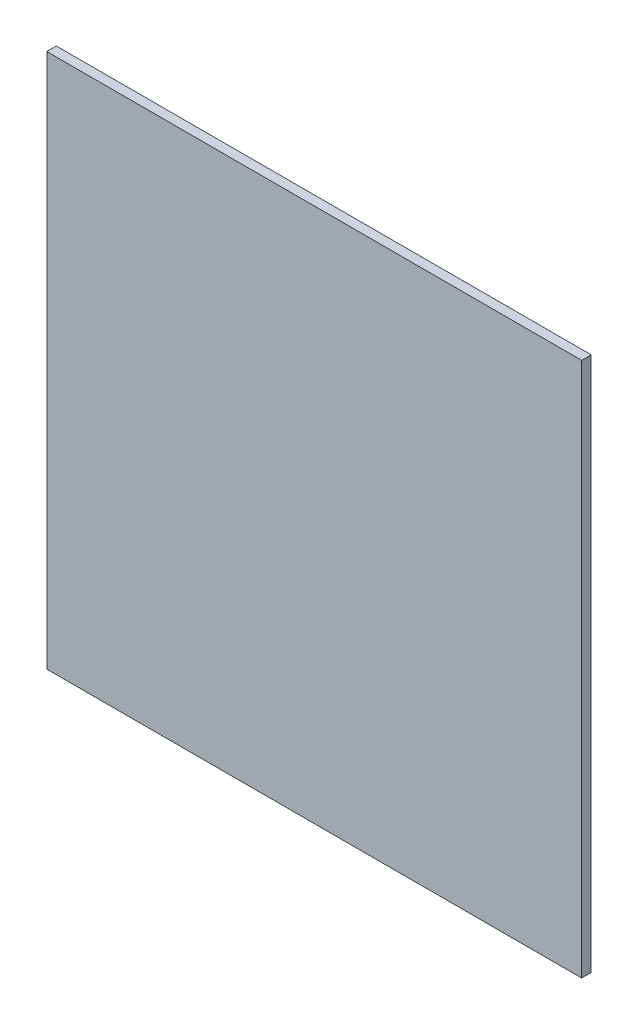
ISO-10303-21;
HEADER;
FILE_DESCRIPTION(('STEP AP214'),'2;1');
FILE_NAME('part.step','',(''),(''),'','','');
FILE_SCHEMA(('AUTOMOTIVE_DESIGN { 1 0 10303 214 1 1 1 1 }'));
ENDSEC;
DATA;
#1=APPLICATION_CONTEXT('core data for automotive mechanical design processes');
#2=APPLICATION_PROTOCOL_DEFINITION('international standard','automotive_design',2000,#1);
#3=PRODUCT_CONTEXT('',#1,'mechanical');
#4=PRODUCT('Part','Part','',(#3));
#5=PRODUCT_RELATED_PRODUCT_CATEGORY('part','',(#4));
#6=PRODUCT_DEFINITION_FORMATION('','',#4);
#7=PRODUCT_DEFINITION_CONTEXT('part definition',#1,'design');
#8=PRODUCT_DEFINITION('design','',#6,#7);
#9=PRODUCT_DEFINITION_SHAPE('','',#8);
#10=(LENGTH_UNIT() NAMED_UNIT(*) SI_UNIT(.MILLI.,.METRE.));
#11=(NAMED_UNIT(*) PLANE_ANGLE_UNIT() SI_UNIT($,.RADIAN.));
#12=(NAMED_UNIT(*) SI_UNIT($,.STERADIAN.) SOLID_ANGLE_UNIT());
#13=UNCERTAINTY_MEASURE_WITH_UNIT(LENGTH_MEASURE(1.E-05),#10,'distance_accuracy_value','');
#14=(GEOMETRIC_REPRESENTATION_CONTEXT(3) GLOBAL_UNCERTAINTY_ASSIGNED_CONTEXT((#13)) GLOBAL_UNIT_ASSIGNED_CONTEXT((#10,
#11,#12)) REPRESENTATION_CONTEXT('',''));
#15=CARTESIAN_POINT('',(0.,0.,0.));
#16=DIRECTION('',(0.,0.,1.));
#17=DIRECTION('',(1.,0.,0.));
#18=AXIS2_PLACEMENT_3D('',#15,#16,#17);
#19=CARTESIAN_POINT('',(0.,0.,0.));
#20=DIRECTION('',(1.,0.,0.));
#21=DIRECTION('',(0.,0.,1.));
#22=AXIS2_PLACEMENT_3D('',#19,#20,#21);
#23=PLANE('',#22);
#24=DIRECTION('',(0.,1.,0.));
#25=VECTOR('',#24,1.);
#26=CARTESIAN_POINT('',(0.,0.,0.1));
#27=LINE('',#26,#25);
#28=CARTESIAN_POINT('',(0.,0.,0.1));
#29=VERTEX_POINT('',#28);
#30=CARTESIAN_POINT('',(0.,5.6,0.1));
#31=VERTEX_POINT('',#30);
#32=EDGE_CURVE('E11',#29,#31,#27,.T.);
#33=ORIENTED_EDGE('',*,*,#32,.T.);
#34=DIRECTION('',(0.,0.,1.));
#35=VECTOR('',#34,1.);
#36=CARTESIAN_POINT('',(0.,5.6,0.));
#37=LINE('',#36,#35);
#38=CARTESIAN_POINT('',(0.,5.6,0.));
#39=VERTEX_POINT('',#38);
#40=EDGE_CURVE('E23',#39,#31,#37,.T.);
#41=ORIENTED_EDGE('',*,*,#40,.F.);
#42=DIRECTION('',(0.,1.,0.));
#43=VECTOR('',#42,1.);
#44=CARTESIAN_POINT('',(0.,0.,0.));
#45=LINE('',#44,#43);
#46=CARTESIAN_POINT('',(0.,0.,0.));
#47=VERTEX_POINT('',#46);
#48=EDGE_CURVE('E85',#47,#39,#45,.T.);
#49=ORIENTED_EDGE('',*,*,#48,.F.);
#50=DIRECTION('',(0.,0.,1.));
#51=VECTOR('',#50,1.);
#52=CARTESIAN_POINT('',(0.,0.,0.));
#53=LINE('',#52,#51);
#54=EDGE_CURVE('E35',#47,#29,#53,.T.);
#55=ORIENTED_EDGE('',*,*,#54,.T.);
#56=EDGE_LOOP('',(#33,#41,#49,#55));
#57=FACE_BOUND('',#56,.T.);
#58=ADVANCED_FACE('F16',(#57),#23,.F.);
#59=CARTESIAN_POINT('',(5.6,0.,0.));
#60=DIRECTION('',(1.,0.,0.));
#61=DIRECTION('',(0.,0.,1.));
#62=AXIS2_PLACEMENT_3D('',#59,#60,#61);
#63=PLANE('',#62);
#64=DIRECTION('',(0.,0.,1.));
#65=VECTOR('',#64,1.);
#66=CARTESIAN_POINT('',(5.6,0.,0.));
#67=LINE('',#66,#65);
#68=CARTESIAN_POINT('',(5.6,0.,0.));
#69=VERTEX_POINT('',#68);
#70=CARTESIAN_POINT('',(5.6,0.,0.1));
#71=VERTEX_POINT('',#70);
#72=EDGE_CURVE('E82',#69,#71,#67,.T.);
#73=ORIENTED_EDGE('',*,*,#72,.F.);
#74=DIRECTION('',(0.,1.,0.));
#75=VECTOR('',#74,1.);
#76=CARTESIAN_POINT('',(5.6,0.,0.));
#77=LINE('',#76,#75);
#78=CARTESIAN_POINT('',(5.6,5.6,0.));
#79=VERTEX_POINT('',#78);
#80=EDGE_CURVE('E62',#69,#79,#77,.T.);
#81=ORIENTED_EDGE('',*,*,#80,.T.);
#82=DIRECTION('',(0.,0.,1.));
#83=VECTOR('',#82,1.);
#84=CARTESIAN_POINT('',(5.6,5.6,0.));
#85=LINE('',#84,#83);
#86=CARTESIAN_POINT('',(5.6,5.6,0.1));
#87=VERTEX_POINT('',#86);
#88=EDGE_CURVE('E56',#79,#87,#85,.T.);
#89=ORIENTED_EDGE('',*,*,#88,.T.);
#90=DIRECTION('',(0.,1.,0.));
#91=VECTOR('',#90,1.);
#92=CARTESIAN_POINT('',(5.6,0.,0.1));
#93=LINE('',#92,#91);
#94=EDGE_CURVE('E59',#71,#87,#93,.T.);
#95=ORIENTED_EDGE('',*,*,#94,.F.);
#96=EDGE_LOOP('',(#73,#81,#89,#95));
#97=FACE_BOUND('',#96,.T.);
#98=ADVANCED_FACE('F58',(#97),#63,.T.);
#99=CARTESIAN_POINT('',(0.,0.,0.));
#100=DIRECTION('',(0.,1.,0.));
#101=DIRECTION('',(0.,0.,1.));
#102=AXIS2_PLACEMENT_3D('',#99,#100,#101);
#103=PLANE('',#102);
#104=ORIENTED_EDGE('',*,*,#72,.T.);
#105=DIRECTION('',(1.,0.,0.));
#106=VECTOR('',#105,1.);
#107=CARTESIAN_POINT('',(0.,0.,0.1));
#108=LINE('',#107,#106);
#109=EDGE_CURVE('E70',#29,#71,#108,.T.);
#110=ORIENTED_EDGE('',*,*,#109,.F.);
#111=ORIENTED_EDGE('',*,*,#54,.F.);
#112=DIRECTION('',(1.,0.,0.));
#113=VECTOR('',#112,1.);
#114=CARTESIAN_POINT('',(0.,0.,0.));
#115=LINE('',#114,#113);
#116=EDGE_CURVE('E75',#47,#69,#115,.T.);
#117=ORIENTED_EDGE('',*,*,#116,.T.);
#118=EDGE_LOOP('',(#104,#110,#111,#117));
#119=FACE_BOUND('',#118,.T.);
#120=ADVANCED_FACE('F90',(#119),#103,.F.);
#121=CARTESIAN_POINT('',(0.,5.6,0.));
#122=DIRECTION('',(0.,1.,0.));
#123=DIRECTION('',(0.,0.,1.));
#124=AXIS2_PLACEMENT_3D('',#121,#122,#123);
#125=PLANE('',#124);
#126=DIRECTION('',(1.,0.,0.));
#127=VECTOR('',#126,1.);
#128=CARTESIAN_POINT('',(0.,5.6,0.));
#129=LINE('',#128,#127);
#130=EDGE_CURVE('E73',#39,#79,#129,.T.);
#131=ORIENTED_EDGE('',*,*,#130,.F.);
#132=ORIENTED_EDGE('',*,*,#40,.T.);
#133=DIRECTION('',(1.,0.,0.));
#134=VECTOR('',#133,1.);
#135=CARTESIAN_POINT('',(0.,5.6,0.1));
#136=LINE('',#135,#134);
#137=EDGE_CURVE('E68',#31,#87,#136,.T.);
#138=ORIENTED_EDGE('',*,*,#137,.T.);
#139=ORIENTED_EDGE('',*,*,#88,.F.);
#140=EDGE_LOOP('',(#131,#132,#138,#139));
#141=FACE_BOUND('',#140,.T.);
#142=ADVANCED_FACE('F72',(#141),#125,.T.);
#143=CARTESIAN_POINT('',(0.,0.,0.));
#144=DIRECTION('',(0.,0.,1.));
#145=DIRECTION('',(1.,0.,0.));
#146=AXIS2_PLACEMENT_3D('',#143,#144,#145);
#147=PLANE('',#146);
#148=ORIENTED_EDGE('',*,*,#130,.T.);
#149=ORIENTED_EDGE('',*,*,#80,.F.);
#150=ORIENTED_EDGE('',*,*,#116,.F.);
#151=ORIENTED_EDGE('',*,*,#48,.T.);
#152=EDGE_LOOP('',(#148,#149,#150,#151));
#153=FACE_BOUND('',#152,.T.);
#154=ADVANCED_FACE('F88',(#153),#147,.F.);
#155=CARTESIAN_POINT('',(0.,0.,0.1));
#156=DIRECTION('',(0.,0.,1.));
#157=DIRECTION('',(1.,0.,0.));
#158=AXIS2_PLACEMENT_3D('',#155,#156,#157);
#159=PLANE('',#158);
#160=ORIENTED_EDGE('',*,*,#32,.F.);
#161=ORIENTED_EDGE('',*,*,#109,.T.);
#162=ORIENTED_EDGE('',*,*,#94,.T.);
#163=ORIENTED_EDGE('',*,*,#137,.F.);
#164=EDGE_LOOP('',(#160,#161,#162,#163));
#165=FACE_BOUND('',#164,.T.);
#166=ADVANCED_FACE('F67',(#165),#159,.T.);
#167=CLOSED_SHELL('',(#58,#98,#120,#142,#154,#166));
#168=MANIFOLD_SOLID_BREP('B1',#167);
#169=ADVANCED_BREP_SHAPE_REPRESENTATION('',(#18,#168),#14);
#170=SHAPE_DEFINITION_REPRESENTATION(#9,#169);
ENDSEC;
END-ISO-10303-21;
